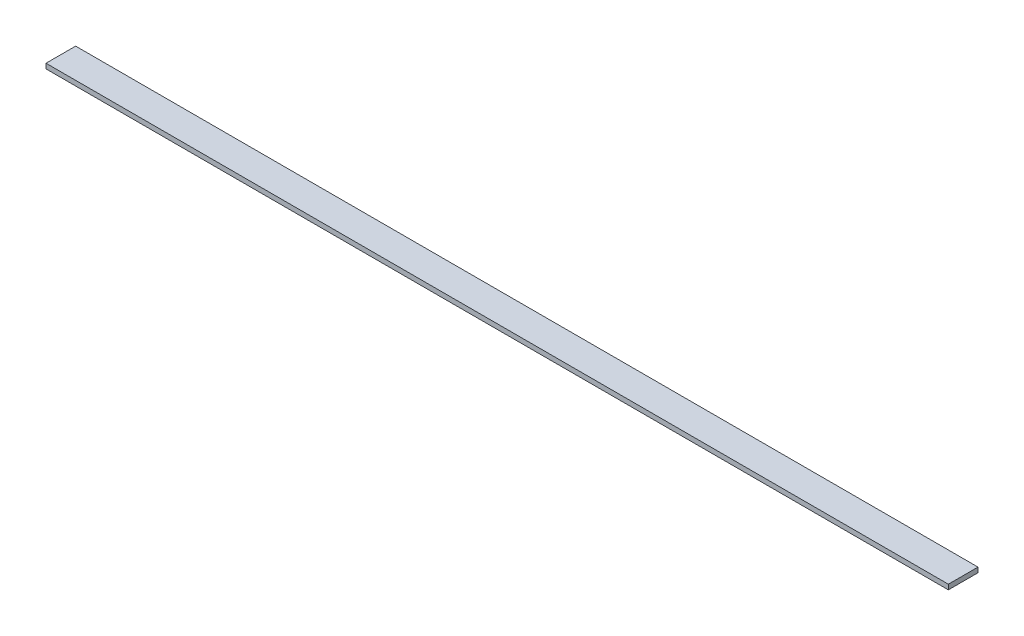
ISO-10303-21;
HEADER;
FILE_DESCRIPTION(('STEP AP214'),'2;1');
FILE_NAME('part.step','',(''),(''),'','','');
FILE_SCHEMA(('AUTOMOTIVE_DESIGN { 1 0 10303 214 1 1 1 1 }'));
ENDSEC;
DATA;
#1=APPLICATION_CONTEXT('core data for automotive mechanical design processes');
#2=APPLICATION_PROTOCOL_DEFINITION('international standard','automotive_design',2000,#1);
#3=PRODUCT_CONTEXT('',#1,'mechanical');
#4=PRODUCT('Part','Part','',(#3));
#5=PRODUCT_RELATED_PRODUCT_CATEGORY('part','',(#4));
#6=PRODUCT_DEFINITION_FORMATION('','',#4);
#7=PRODUCT_DEFINITION_CONTEXT('part definition',#1,'design');
#8=PRODUCT_DEFINITION('design','',#6,#7);
#9=PRODUCT_DEFINITION_SHAPE('','',#8);
#10=(LENGTH_UNIT() NAMED_UNIT(*) SI_UNIT(.MILLI.,.METRE.));
#11=(NAMED_UNIT(*) PLANE_ANGLE_UNIT() SI_UNIT($,.RADIAN.));
#12=(NAMED_UNIT(*) SI_UNIT($,.STERADIAN.) SOLID_ANGLE_UNIT());
#13=UNCERTAINTY_MEASURE_WITH_UNIT(LENGTH_MEASURE(1.E-05),#10,'distance_accuracy_value','');
#14=(GEOMETRIC_REPRESENTATION_CONTEXT(3) GLOBAL_UNCERTAINTY_ASSIGNED_CONTEXT((#13)) GLOBAL_UNIT_ASSIGNED_CONTEXT((#10,
#11,#12)) REPRESENTATION_CONTEXT('',''));
#15=CARTESIAN_POINT('',(0.,0.,0.));
#16=DIRECTION('',(0.,0.,1.));
#17=DIRECTION('',(1.,0.,0.));
#18=AXIS2_PLACEMENT_3D('',#15,#16,#17);
#19=CARTESIAN_POINT('',(0.,1.5,0.));
#20=DIRECTION('',(1.,0.,0.));
#21=DIRECTION('',(0.,0.,-1.));
#22=AXIS2_PLACEMENT_3D('',#19,#20,#21);
#23=PLANE('',#22);
#24=DIRECTION('',(0.,0.,1.));
#25=VECTOR('',#24,1.);
#26=CARTESIAN_POINT('',(0.,0.,0.));
#27=LINE('',#26,#25);
#28=CARTESIAN_POINT('',(0.,0.,-9.));
#29=VERTEX_POINT('',#28);
#30=CARTESIAN_POINT('',(0.,0.,0.));
#31=VERTEX_POINT('',#30);
#32=EDGE_CURVE('E96',#29,#31,#27,.T.);
#33=ORIENTED_EDGE('',*,*,#32,.T.);
#34=DIRECTION('',(0.,-1.,0.));
#35=VECTOR('',#34,1.);
#36=CARTESIAN_POINT('',(0.,1.5,0.));
#37=LINE('',#36,#35);
#38=CARTESIAN_POINT('',(0.,1.5,0.));
#39=VERTEX_POINT('',#38);
#40=EDGE_CURVE('E11',#39,#31,#37,.T.);
#41=ORIENTED_EDGE('',*,*,#40,.F.);
#42=DIRECTION('',(0.,0.,1.));
#43=VECTOR('',#42,1.);
#44=CARTESIAN_POINT('',(0.,1.5,0.));
#45=LINE('',#44,#43);
#46=CARTESIAN_POINT('',(0.,1.5,-9.));
#47=VERTEX_POINT('',#46);
#48=EDGE_CURVE('E84',#47,#39,#45,.T.);
#49=ORIENTED_EDGE('',*,*,#48,.F.);
#50=DIRECTION('',(0.,-1.,0.));
#51=VECTOR('',#50,1.);
#52=CARTESIAN_POINT('',(0.,1.5,-9.));
#53=LINE('',#52,#51);
#54=EDGE_CURVE('E92',#47,#29,#53,.T.);
#55=ORIENTED_EDGE('',*,*,#54,.T.);
#56=EDGE_LOOP('',(#33,#41,#49,#55));
#57=FACE_BOUND('',#56,.T.);
#58=ADVANCED_FACE('F33',(#57),#23,.F.);
#59=CARTESIAN_POINT('',(0.,1.5,0.));
#60=DIRECTION('',(0.,0.,-1.));
#61=DIRECTION('',(-1.,0.,0.));
#62=AXIS2_PLACEMENT_3D('',#59,#60,#61);
#63=PLANE('',#62);
#64=DIRECTION('',(1.,0.,0.));
#65=VECTOR('',#64,1.);
#66=CARTESIAN_POINT('',(0.,0.,0.));
#67=LINE('',#66,#65);
#68=CARTESIAN_POINT('',(274.,0.,0.));
#69=VERTEX_POINT('',#68);
#70=EDGE_CURVE('E88',#31,#69,#67,.T.);
#71=ORIENTED_EDGE('',*,*,#70,.T.);
#72=DIRECTION('',(0.,-1.,0.));
#73=VECTOR('',#72,1.);
#74=CARTESIAN_POINT('',(274.,1.5,0.));
#75=LINE('',#74,#73);
#76=CARTESIAN_POINT('',(274.,1.5,0.));
#77=VERTEX_POINT('',#76);
#78=EDGE_CURVE('E41',#77,#69,#75,.T.);
#79=ORIENTED_EDGE('',*,*,#78,.F.);
#80=DIRECTION('',(1.,0.,0.));
#81=VECTOR('',#80,1.);
#82=CARTESIAN_POINT('',(0.,1.5,0.));
#83=LINE('',#82,#81);
#84=EDGE_CURVE('E79',#39,#77,#83,.T.);
#85=ORIENTED_EDGE('',*,*,#84,.F.);
#86=ORIENTED_EDGE('',*,*,#40,.T.);
#87=EDGE_LOOP('',(#71,#79,#85,#86));
#88=FACE_BOUND('',#87,.T.);
#89=ADVANCED_FACE('F87',(#88),#63,.F.);
#90=CARTESIAN_POINT('',(274.,1.5,0.));
#91=DIRECTION('',(-1.,0.,0.));
#92=DIRECTION('',(0.,0.,1.));
#93=AXIS2_PLACEMENT_3D('',#90,#91,#92);
#94=PLANE('',#93);
#95=DIRECTION('',(0.,0.,-1.));
#96=VECTOR('',#95,1.);
#97=CARTESIAN_POINT('',(274.,0.,0.));
#98=LINE('',#97,#96);
#99=CARTESIAN_POINT('',(274.,0.,-9.));
#100=VERTEX_POINT('',#99);
#101=EDGE_CURVE('E66',#69,#100,#98,.T.);
#102=ORIENTED_EDGE('',*,*,#101,.T.);
#103=DIRECTION('',(0.,-1.,0.));
#104=VECTOR('',#103,1.);
#105=CARTESIAN_POINT('',(274.,1.5,-9.));
#106=LINE('',#105,#104);
#107=CARTESIAN_POINT('',(274.,1.5,-9.));
#108=VERTEX_POINT('',#107);
#109=EDGE_CURVE('E89',#108,#100,#106,.T.);
#110=ORIENTED_EDGE('',*,*,#109,.F.);
#111=DIRECTION('',(0.,0.,-1.));
#112=VECTOR('',#111,1.);
#113=CARTESIAN_POINT('',(274.,1.5,0.));
#114=LINE('',#113,#112);
#115=EDGE_CURVE('E82',#77,#108,#114,.T.);
#116=ORIENTED_EDGE('',*,*,#115,.F.);
#117=ORIENTED_EDGE('',*,*,#78,.T.);
#118=EDGE_LOOP('',(#102,#110,#116,#117));
#119=FACE_BOUND('',#118,.T.);
#120=ADVANCED_FACE('F90',(#119),#94,.F.);
#121=CARTESIAN_POINT('',(0.,1.5,-9.));
#122=DIRECTION('',(0.,0.,1.));
#123=DIRECTION('',(1.,0.,0.));
#124=AXIS2_PLACEMENT_3D('',#121,#122,#123);
#125=PLANE('',#124);
#126=DIRECTION('',(-1.,0.,0.));
#127=VECTOR('',#126,1.);
#128=CARTESIAN_POINT('',(0.,0.,-9.));
#129=LINE('',#128,#127);
#130=EDGE_CURVE('E72',#100,#29,#129,.T.);
#131=ORIENTED_EDGE('',*,*,#130,.T.);
#132=ORIENTED_EDGE('',*,*,#54,.F.);
#133=DIRECTION('',(-1.,0.,0.));
#134=VECTOR('',#133,1.);
#135=CARTESIAN_POINT('',(0.,1.5,-9.));
#136=LINE('',#135,#134);
#137=EDGE_CURVE('E49',#108,#47,#136,.T.);
#138=ORIENTED_EDGE('',*,*,#137,.F.);
#139=ORIENTED_EDGE('',*,*,#109,.T.);
#140=EDGE_LOOP('',(#131,#132,#138,#139));
#141=FACE_BOUND('',#140,.T.);
#142=ADVANCED_FACE('F103',(#141),#125,.F.);
#143=CARTESIAN_POINT('',(0.,1.5,0.));
#144=DIRECTION('',(0.,-1.,0.));
#145=DIRECTION('',(0.,0.,-1.));
#146=AXIS2_PLACEMENT_3D('',#143,#144,#145);
#147=PLANE('',#146);
#148=ORIENTED_EDGE('',*,*,#48,.T.);
#149=ORIENTED_EDGE('',*,*,#84,.T.);
#150=ORIENTED_EDGE('',*,*,#115,.T.);
#151=ORIENTED_EDGE('',*,*,#137,.T.);
#152=EDGE_LOOP('',(#148,#149,#150,#151));
#153=FACE_BOUND('',#152,.T.);
#154=ADVANCED_FACE('F80',(#153),#147,.F.);
#155=CARTESIAN_POINT('',(0.,0.,0.));
#156=DIRECTION('',(0.,-1.,0.));
#157=DIRECTION('',(0.,0.,-1.));
#158=AXIS2_PLACEMENT_3D('',#155,#156,#157);
#159=PLANE('',#158);
#160=ORIENTED_EDGE('',*,*,#32,.F.);
#161=ORIENTED_EDGE('',*,*,#130,.F.);
#162=ORIENTED_EDGE('',*,*,#101,.F.);
#163=ORIENTED_EDGE('',*,*,#70,.F.);
#164=EDGE_LOOP('',(#160,#161,#162,#163));
#165=FACE_BOUND('',#164,.T.);
#166=ADVANCED_FACE('F106',(#165),#159,.T.);
#167=CLOSED_SHELL('',(#58,#89,#120,#142,#154,#166));
#168=MANIFOLD_SOLID_BREP('B2',#167);
#169=ADVANCED_BREP_SHAPE_REPRESENTATION('',(#18,#168),#14);
#170=SHAPE_DEFINITION_REPRESENTATION(#9,#169);
ENDSEC;
END-ISO-10303-21;
